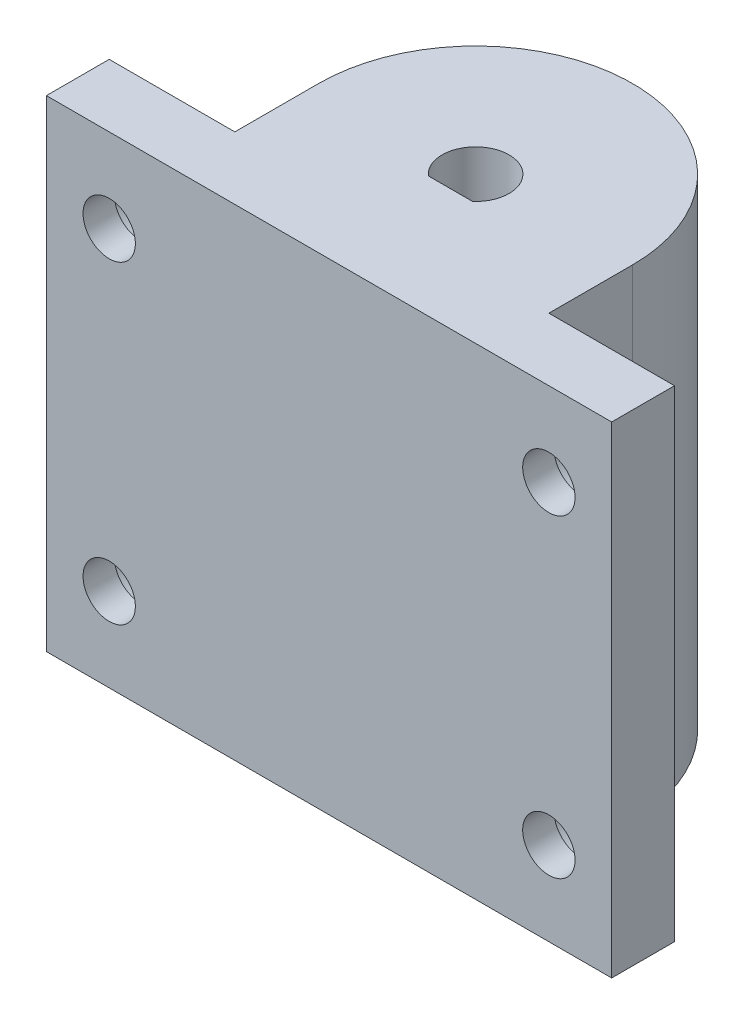
ISO-10303-21;
HEADER;
FILE_DESCRIPTION(('STEP AP214'),'2;1');
FILE_NAME('part.step','',(''),(''),'','','');
FILE_SCHEMA(('AUTOMOTIVE_DESIGN { 1 0 10303 214 1 1 1 1 }'));
ENDSEC;
DATA;
#1=APPLICATION_CONTEXT('core data for automotive mechanical design processes');
#2=APPLICATION_PROTOCOL_DEFINITION('international standard','automotive_design',2000,#1);
#3=PRODUCT_CONTEXT('',#1,'mechanical');
#4=PRODUCT('Part','Part','',(#3));
#5=PRODUCT_RELATED_PRODUCT_CATEGORY('part','',(#4));
#6=PRODUCT_DEFINITION_FORMATION('','',#4);
#7=PRODUCT_DEFINITION_CONTEXT('part definition',#1,'design');
#8=PRODUCT_DEFINITION('design','',#6,#7);
#9=PRODUCT_DEFINITION_SHAPE('','',#8);
#10=(LENGTH_UNIT() NAMED_UNIT(*) SI_UNIT(.MILLI.,.METRE.));
#11=(NAMED_UNIT(*) PLANE_ANGLE_UNIT() SI_UNIT($,.RADIAN.));
#12=(NAMED_UNIT(*) SI_UNIT($,.STERADIAN.) SOLID_ANGLE_UNIT());
#13=UNCERTAINTY_MEASURE_WITH_UNIT(LENGTH_MEASURE(1.E-05),#10,'distance_accuracy_value','');
#14=(GEOMETRIC_REPRESENTATION_CONTEXT(3) GLOBAL_UNCERTAINTY_ASSIGNED_CONTEXT((#13)) GLOBAL_UNIT_ASSIGNED_CONTEXT((#10,
#11,#12)) REPRESENTATION_CONTEXT('',''));
#15=CARTESIAN_POINT('',(0.,0.,0.));
#16=DIRECTION('',(0.,0.,1.));
#17=DIRECTION('',(1.,0.,0.));
#18=AXIS2_PLACEMENT_3D('',#15,#16,#17);
#19=CARTESIAN_POINT('',(114.5,19.,14.));
#20=DIRECTION('',(0.,0.,1.));
#21=DIRECTION('',(1.,0.,0.));
#22=AXIS2_PLACEMENT_3D('',#19,#20,#21);
#23=CYLINDRICAL_SURFACE('',#22,1.25);
#24=CARTESIAN_POINT('',(114.5,19.,17.));
#25=DIRECTION('',(0.,0.,1.));
#26=DIRECTION('',(1.,0.,0.));
#27=AXIS2_PLACEMENT_3D('',#24,#25,#26);
#28=CIRCLE('',#27,1.25);
#29=CARTESIAN_POINT('',(115.75,19.,17.));
#30=VERTEX_POINT('',#29);
#31=EDGE_CURVE('E299',#30,#30,#28,.T.);
#32=ORIENTED_EDGE('',*,*,#31,.T.);
#33=EDGE_LOOP('',(#32));
#34=FACE_BOUND('',#33,.T.);
#35=CARTESIAN_POINT('',(114.5,19.,15.5));
#36=DIRECTION('',(0.,0.,-1.));
#37=DIRECTION('',(-1.,0.,0.));
#38=AXIS2_PLACEMENT_3D('',#35,#36,#37);
#39=CIRCLE('',#38,1.25);
#40=CARTESIAN_POINT('',(113.25,19.,15.5));
#41=VERTEX_POINT('',#40);
#42=EDGE_CURVE('E129',#41,#41,#39,.F.);
#43=ORIENTED_EDGE('',*,*,#42,.F.);
#44=EDGE_LOOP('',(#43));
#45=FACE_BOUND('',#44,.T.);
#46=ADVANCED_FACE('F125',(#34,#45),#23,.F.);
#47=CARTESIAN_POINT('',(114.5,4.,14.));
#48=DIRECTION('',(0.,0.,1.));
#49=DIRECTION('',(1.,0.,0.));
#50=AXIS2_PLACEMENT_3D('',#47,#48,#49);
#51=CYLINDRICAL_SURFACE('',#50,1.25);
#52=CARTESIAN_POINT('',(114.5,4.,17.));
#53=DIRECTION('',(0.,0.,1.));
#54=DIRECTION('',(1.,0.,0.));
#55=AXIS2_PLACEMENT_3D('',#52,#53,#54);
#56=CIRCLE('',#55,1.25);
#57=CARTESIAN_POINT('',(115.75,4.,17.));
#58=VERTEX_POINT('',#57);
#59=EDGE_CURVE('E291',#58,#58,#56,.T.);
#60=ORIENTED_EDGE('',*,*,#59,.T.);
#61=EDGE_LOOP('',(#60));
#62=FACE_BOUND('',#61,.T.);
#63=CARTESIAN_POINT('',(114.5,4.,15.5));
#64=DIRECTION('',(0.,0.,-1.));
#65=DIRECTION('',(-1.,0.,0.));
#66=AXIS2_PLACEMENT_3D('',#63,#64,#65);
#67=CIRCLE('',#66,1.25);
#68=CARTESIAN_POINT('',(113.25,4.,15.5));
#69=VERTEX_POINT('',#68);
#70=EDGE_CURVE('E277',#69,#69,#67,.F.);
#71=ORIENTED_EDGE('',*,*,#70,.F.);
#72=EDGE_LOOP('',(#71));
#73=FACE_BOUND('',#72,.T.);
#74=ADVANCED_FACE('F350',(#62,#73),#51,.F.);
#75=CARTESIAN_POINT('',(135.5,4.,14.));
#76=DIRECTION('',(0.,0.,1.));
#77=DIRECTION('',(1.,0.,0.));
#78=AXIS2_PLACEMENT_3D('',#75,#76,#77);
#79=CYLINDRICAL_SURFACE('',#78,1.25000000000001);
#80=CARTESIAN_POINT('',(135.5,4.,17.));
#81=DIRECTION('',(0.,0.,1.));
#82=DIRECTION('',(1.,0.,0.));
#83=AXIS2_PLACEMENT_3D('',#80,#81,#82);
#84=CIRCLE('',#83,1.25000000000001);
#85=CARTESIAN_POINT('',(136.75,4.,17.));
#86=VERTEX_POINT('',#85);
#87=EDGE_CURVE('E286',#86,#86,#84,.T.);
#88=ORIENTED_EDGE('',*,*,#87,.T.);
#89=EDGE_LOOP('',(#88));
#90=FACE_BOUND('',#89,.T.);
#91=CARTESIAN_POINT('',(135.5,4.,15.5));
#92=DIRECTION('',(0.,0.,-1.));
#93=DIRECTION('',(-1.,0.,0.));
#94=AXIS2_PLACEMENT_3D('',#91,#92,#93);
#95=CIRCLE('',#94,1.25000000000001);
#96=CARTESIAN_POINT('',(134.25,4.,15.5));
#97=VERTEX_POINT('',#96);
#98=EDGE_CURVE('E274',#97,#97,#95,.F.);
#99=ORIENTED_EDGE('',*,*,#98,.F.);
#100=EDGE_LOOP('',(#99));
#101=FACE_BOUND('',#100,.T.);
#102=ADVANCED_FACE('F357',(#90,#101),#79,.F.);
#103=CARTESIAN_POINT('',(135.5,19.,14.));
#104=DIRECTION('',(0.,0.,1.));
#105=DIRECTION('',(1.,0.,0.));
#106=AXIS2_PLACEMENT_3D('',#103,#104,#105);
#107=CYLINDRICAL_SURFACE('',#106,1.25000000000001);
#108=CARTESIAN_POINT('',(135.5,19.,17.));
#109=DIRECTION('',(0.,0.,1.));
#110=DIRECTION('',(1.,0.,0.));
#111=AXIS2_PLACEMENT_3D('',#108,#109,#110);
#112=CIRCLE('',#111,1.25000000000001);
#113=CARTESIAN_POINT('',(136.75,19.,17.));
#114=VERTEX_POINT('',#113);
#115=EDGE_CURVE('E282',#114,#114,#112,.T.);
#116=ORIENTED_EDGE('',*,*,#115,.T.);
#117=EDGE_LOOP('',(#116));
#118=FACE_BOUND('',#117,.T.);
#119=CARTESIAN_POINT('',(135.5,19.,15.5));
#120=DIRECTION('',(0.,0.,-1.));
#121=DIRECTION('',(-1.,0.,0.));
#122=AXIS2_PLACEMENT_3D('',#119,#120,#121);
#123=CIRCLE('',#122,1.25000000000001);
#124=CARTESIAN_POINT('',(134.25,19.,15.5));
#125=VERTEX_POINT('',#124);
#126=EDGE_CURVE('E271',#125,#125,#123,.F.);
#127=ORIENTED_EDGE('',*,*,#126,.F.);
#128=EDGE_LOOP('',(#127));
#129=FACE_BOUND('',#128,.T.);
#130=ADVANCED_FACE('F380',(#118,#129),#107,.F.);
#131=CARTESIAN_POINT('',(0.,23.,0.));
#132=DIRECTION('',(0.,1.,0.));
#133=DIRECTION('',(0.,0.,1.));
#134=AXIS2_PLACEMENT_3D('',#131,#132,#133);
#135=PLANE('',#134);
#136=DIRECTION('',(0.,0.,1.));
#137=VECTOR('',#136,1.);
#138=CARTESIAN_POINT('',(117.5,23.,0.));
#139=LINE('',#138,#137);
#140=CARTESIAN_POINT('',(117.5,23.,10.));
#141=VERTEX_POINT('',#140);
#142=CARTESIAN_POINT('',(117.5,23.,14.));
#143=VERTEX_POINT('',#142);
#144=EDGE_CURVE('E238',#141,#143,#139,.T.);
#145=ORIENTED_EDGE('',*,*,#144,.T.);
#146=DIRECTION('',(1.,0.,0.));
#147=VECTOR('',#146,1.);
#148=CARTESIAN_POINT('',(111.5,23.,14.));
#149=LINE('',#148,#147);
#150=CARTESIAN_POINT('',(111.5,23.,14.));
#151=VERTEX_POINT('',#150);
#152=EDGE_CURVE('E213',#151,#143,#149,.T.);
#153=ORIENTED_EDGE('',*,*,#152,.F.);
#154=DIRECTION('',(0.,0.,1.));
#155=VECTOR('',#154,1.);
#156=CARTESIAN_POINT('',(111.5,23.,14.));
#157=LINE('',#156,#155);
#158=CARTESIAN_POINT('',(111.5,23.,17.));
#159=VERTEX_POINT('',#158);
#160=EDGE_CURVE('E310',#151,#159,#157,.T.);
#161=ORIENTED_EDGE('',*,*,#160,.T.);
#162=DIRECTION('',(1.,0.,0.));
#163=VECTOR('',#162,1.);
#164=CARTESIAN_POINT('',(102.5,23.,17.));
#165=LINE('',#164,#163);
#166=CARTESIAN_POINT('',(138.5,23.,17.));
#167=VERTEX_POINT('',#166);
#168=EDGE_CURVE('E228',#159,#167,#165,.T.);
#169=ORIENTED_EDGE('',*,*,#168,.T.);
#170=DIRECTION('',(0.,0.,1.));
#171=VECTOR('',#170,1.);
#172=CARTESIAN_POINT('',(138.5,23.,14.));
#173=LINE('',#172,#171);
#174=CARTESIAN_POINT('',(138.5,23.,14.));
#175=VERTEX_POINT('',#174);
#176=EDGE_CURVE('E220',#175,#167,#173,.T.);
#177=ORIENTED_EDGE('',*,*,#176,.F.);
#178=CARTESIAN_POINT('',(132.5,23.,14.));
#179=VERTEX_POINT('',#178);
#180=EDGE_CURVE('E202',#179,#175,#149,.T.);
#181=ORIENTED_EDGE('',*,*,#180,.F.);
#182=DIRECTION('',(0.,0.,1.));
#183=VECTOR('',#182,1.);
#184=CARTESIAN_POINT('',(132.5,23.,0.));
#185=LINE('',#184,#183);
#186=CARTESIAN_POINT('',(132.5,23.,10.));
#187=VERTEX_POINT('',#186);
#188=EDGE_CURVE('E242',#187,#179,#185,.T.);
#189=ORIENTED_EDGE('',*,*,#188,.F.);
#190=CARTESIAN_POINT('',(125.,23.,10.));
#191=DIRECTION('',(0.,1.,0.));
#192=DIRECTION('',(0.,0.,1.));
#193=AXIS2_PLACEMENT_3D('',#190,#191,#192);
#194=CIRCLE('',#193,7.50000000000001);
#195=EDGE_CURVE('E249',#187,#141,#194,.T.);
#196=ORIENTED_EDGE('',*,*,#195,.T.);
#197=EDGE_LOOP('',(#145,#153,#161,#169,#177,#181,#189,#196));
#198=FACE_BOUND('',#197,.T.);
#199=DIRECTION('',(1.,0.,0.));
#200=VECTOR('',#199,1.);
#201=CARTESIAN_POINT('',(0.,23.,11.2));
#202=LINE('',#201,#200);
#203=CARTESIAN_POINT('',(123.941699475574,23.,11.2));
#204=VERTEX_POINT('',#203);
#205=CARTESIAN_POINT('',(126.058300524426,23.,11.2));
#206=VERTEX_POINT('',#205);
#207=EDGE_CURVE('E255',#204,#206,#202,.T.);
#208=ORIENTED_EDGE('',*,*,#207,.F.);
#209=CARTESIAN_POINT('',(125.,23.,10.));
#210=DIRECTION('',(0.,1.,0.));
#211=DIRECTION('',(0.,0.,1.));
#212=AXIS2_PLACEMENT_3D('',#209,#210,#211);
#213=CIRCLE('',#212,1.59999999999999);
#214=EDGE_CURVE('E261',#206,#204,#213,.T.);
#215=ORIENTED_EDGE('',*,*,#214,.F.);
#216=EDGE_LOOP('',(#208,#215));
#217=FACE_BOUND('',#216,.T.);
#218=ADVANCED_FACE('F225',(#198,#217),#135,.T.);
#219=CARTESIAN_POINT('',(0.,0.,0.));
#220=DIRECTION('',(0.,1.,0.));
#221=DIRECTION('',(0.,0.,1.));
#222=AXIS2_PLACEMENT_3D('',#219,#220,#221);
#223=PLANE('',#222);
#224=CARTESIAN_POINT('',(125.,0.,10.));
#225=DIRECTION('',(0.,1.,0.));
#226=DIRECTION('',(0.,0.,1.));
#227=AXIS2_PLACEMENT_3D('',#224,#225,#226);
#228=CIRCLE('',#227,1.59999999999999);
#229=CARTESIAN_POINT('',(126.058300524426,0.,11.2));
#230=VERTEX_POINT('',#229);
#231=CARTESIAN_POINT('',(123.941699475574,0.,11.2));
#232=VERTEX_POINT('',#231);
#233=EDGE_CURVE('E260',#230,#232,#228,.T.);
#234=ORIENTED_EDGE('',*,*,#233,.T.);
#235=DIRECTION('',(1.,0.,0.));
#236=VECTOR('',#235,1.);
#237=CARTESIAN_POINT('',(0.,0.,11.2));
#238=LINE('',#237,#236);
#239=EDGE_CURVE('E257',#232,#230,#238,.T.);
#240=ORIENTED_EDGE('',*,*,#239,.T.);
#241=EDGE_LOOP('',(#234,#240));
#242=FACE_BOUND('',#241,.T.);
#243=DIRECTION('',(0.,0.,1.));
#244=VECTOR('',#243,1.);
#245=CARTESIAN_POINT('',(132.5,0.,0.));
#246=LINE('',#245,#244);
#247=CARTESIAN_POINT('',(132.5,0.,10.));
#248=VERTEX_POINT('',#247);
#249=CARTESIAN_POINT('',(132.5,0.,14.));
#250=VERTEX_POINT('',#249);
#251=EDGE_CURVE('E244',#248,#250,#246,.T.);
#252=ORIENTED_EDGE('',*,*,#251,.T.);
#253=DIRECTION('',(1.,0.,0.));
#254=VECTOR('',#253,1.);
#255=CARTESIAN_POINT('',(111.5,0.,14.));
#256=LINE('',#255,#254);
#257=CARTESIAN_POINT('',(138.5,0.,14.));
#258=VERTEX_POINT('',#257);
#259=EDGE_CURVE('E223',#250,#258,#256,.T.);
#260=ORIENTED_EDGE('',*,*,#259,.T.);
#261=DIRECTION('',(0.,0.,1.));
#262=VECTOR('',#261,1.);
#263=CARTESIAN_POINT('',(138.5,0.,14.));
#264=LINE('',#263,#262);
#265=CARTESIAN_POINT('',(138.5,0.,17.));
#266=VERTEX_POINT('',#265);
#267=EDGE_CURVE('E222',#258,#266,#264,.T.);
#268=ORIENTED_EDGE('',*,*,#267,.T.);
#269=DIRECTION('',(1.,0.,0.));
#270=VECTOR('',#269,1.);
#271=CARTESIAN_POINT('',(102.5,0.,17.));
#272=LINE('',#271,#270);
#273=CARTESIAN_POINT('',(111.5,0.,17.));
#274=VERTEX_POINT('',#273);
#275=EDGE_CURVE('E236',#274,#266,#272,.T.);
#276=ORIENTED_EDGE('',*,*,#275,.F.);
#277=DIRECTION('',(0.,0.,1.));
#278=VECTOR('',#277,1.);
#279=CARTESIAN_POINT('',(111.5,0.,14.));
#280=LINE('',#279,#278);
#281=CARTESIAN_POINT('',(111.5,0.,14.));
#282=VERTEX_POINT('',#281);
#283=EDGE_CURVE('E232',#282,#274,#280,.T.);
#284=ORIENTED_EDGE('',*,*,#283,.F.);
#285=CARTESIAN_POINT('',(117.5,0.,14.));
#286=VERTEX_POINT('',#285);
#287=EDGE_CURVE('E304',#282,#286,#256,.T.);
#288=ORIENTED_EDGE('',*,*,#287,.T.);
#289=DIRECTION('',(0.,0.,1.));
#290=VECTOR('',#289,1.);
#291=CARTESIAN_POINT('',(117.5,0.,0.));
#292=LINE('',#291,#290);
#293=CARTESIAN_POINT('',(117.5,0.,10.));
#294=VERTEX_POINT('',#293);
#295=EDGE_CURVE('E142',#294,#286,#292,.T.);
#296=ORIENTED_EDGE('',*,*,#295,.F.);
#297=CARTESIAN_POINT('',(125.,0.,10.));
#298=DIRECTION('',(0.,1.,0.));
#299=DIRECTION('',(0.,0.,1.));
#300=AXIS2_PLACEMENT_3D('',#297,#298,#299);
#301=CIRCLE('',#300,7.50000000000001);
#302=EDGE_CURVE('E241',#248,#294,#301,.T.);
#303=ORIENTED_EDGE('',*,*,#302,.F.);
#304=EDGE_LOOP('',(#252,#260,#268,#276,#284,#288,#296,#303));
#305=FACE_BOUND('',#304,.T.);
#306=ADVANCED_FACE('F127',(#242,#305),#223,.F.);
#307=CARTESIAN_POINT('',(0.,0.,11.2));
#308=DIRECTION('',(0.,0.,1.));
#309=DIRECTION('',(1.,0.,0.));
#310=AXIS2_PLACEMENT_3D('',#307,#308,#309);
#311=PLANE('',#310);
#312=ORIENTED_EDGE('',*,*,#207,.T.);
#313=DIRECTION('',(0.,1.,0.));
#314=VECTOR('',#313,1.);
#315=CARTESIAN_POINT('',(126.058300524426,0.,11.2));
#316=LINE('',#315,#314);
#317=EDGE_CURVE('E264',#230,#206,#316,.T.);
#318=ORIENTED_EDGE('',*,*,#317,.F.);
#319=ORIENTED_EDGE('',*,*,#239,.F.);
#320=DIRECTION('',(0.,1.,0.));
#321=VECTOR('',#320,1.);
#322=CARTESIAN_POINT('',(123.941699475574,0.,11.2));
#323=LINE('',#322,#321);
#324=EDGE_CURVE('E134',#232,#204,#323,.T.);
#325=ORIENTED_EDGE('',*,*,#324,.T.);
#326=EDGE_LOOP('',(#312,#318,#319,#325));
#327=FACE_BOUND('',#326,.T.);
#328=ADVANCED_FACE('F345',(#327),#311,.F.);
#329=CARTESIAN_POINT('',(125.,0.,10.));
#330=DIRECTION('',(0.,1.,0.));
#331=DIRECTION('',(0.,0.,1.));
#332=AXIS2_PLACEMENT_3D('',#329,#330,#331);
#333=CYLINDRICAL_SURFACE('',#332,1.59999999999999);
#334=ORIENTED_EDGE('',*,*,#214,.T.);
#335=ORIENTED_EDGE('',*,*,#324,.F.);
#336=ORIENTED_EDGE('',*,*,#233,.F.);
#337=ORIENTED_EDGE('',*,*,#317,.T.);
#338=EDGE_LOOP('',(#334,#335,#336,#337));
#339=FACE_BOUND('',#338,.T.);
#340=ADVANCED_FACE('F336',(#339),#333,.F.);
#341=CARTESIAN_POINT('',(132.5,0.,0.));
#342=DIRECTION('',(-1.,0.,0.));
#343=DIRECTION('',(0.,0.,1.));
#344=AXIS2_PLACEMENT_3D('',#341,#342,#343);
#345=PLANE('',#344);
#346=ORIENTED_EDGE('',*,*,#188,.T.);
#347=DIRECTION('',(0.,-1.,0.));
#348=VECTOR('',#347,1.);
#349=CARTESIAN_POINT('',(132.5,0.,14.));
#350=LINE('',#349,#348);
#351=EDGE_CURVE('E208',#179,#250,#350,.T.);
#352=ORIENTED_EDGE('',*,*,#351,.T.);
#353=ORIENTED_EDGE('',*,*,#251,.F.);
#354=DIRECTION('',(0.,1.,0.));
#355=VECTOR('',#354,1.);
#356=CARTESIAN_POINT('',(132.5,0.,10.));
#357=LINE('',#356,#355);
#358=EDGE_CURVE('E253',#248,#187,#357,.T.);
#359=ORIENTED_EDGE('',*,*,#358,.T.);
#360=EDGE_LOOP('',(#346,#352,#353,#359));
#361=FACE_BOUND('',#360,.T.);
#362=ADVANCED_FACE('F334',(#361),#345,.F.);
#363=CARTESIAN_POINT('',(125.,0.,10.));
#364=DIRECTION('',(0.,1.,0.));
#365=DIRECTION('',(0.,0.,1.));
#366=AXIS2_PLACEMENT_3D('',#363,#364,#365);
#367=CYLINDRICAL_SURFACE('',#366,7.50000000000001);
#368=ORIENTED_EDGE('',*,*,#195,.F.);
#369=ORIENTED_EDGE('',*,*,#358,.F.);
#370=ORIENTED_EDGE('',*,*,#302,.T.);
#371=DIRECTION('',(0.,1.,0.));
#372=VECTOR('',#371,1.);
#373=CARTESIAN_POINT('',(117.5,0.,10.));
#374=LINE('',#373,#372);
#375=EDGE_CURVE('E247',#294,#141,#374,.T.);
#376=ORIENTED_EDGE('',*,*,#375,.T.);
#377=EDGE_LOOP('',(#368,#369,#370,#376));
#378=FACE_BOUND('',#377,.T.);
#379=ADVANCED_FACE('F331',(#378),#367,.T.);
#380=CARTESIAN_POINT('',(117.5,0.,0.));
#381=DIRECTION('',(-1.,0.,0.));
#382=DIRECTION('',(0.,0.,1.));
#383=AXIS2_PLACEMENT_3D('',#380,#381,#382);
#384=PLANE('',#383);
#385=DIRECTION('',(0.,-1.,0.));
#386=VECTOR('',#385,1.);
#387=CARTESIAN_POINT('',(117.5,0.,14.));
#388=LINE('',#387,#386);
#389=EDGE_CURVE('E12',#143,#286,#388,.T.);
#390=ORIENTED_EDGE('',*,*,#389,.F.);
#391=ORIENTED_EDGE('',*,*,#144,.F.);
#392=ORIENTED_EDGE('',*,*,#375,.F.);
#393=ORIENTED_EDGE('',*,*,#295,.T.);
#394=EDGE_LOOP('',(#390,#391,#392,#393));
#395=FACE_BOUND('',#394,.T.);
#396=ADVANCED_FACE('F332',(#395),#384,.T.);
#397=CARTESIAN_POINT('',(102.5,0.,17.));
#398=DIRECTION('',(0.,0.,1.));
#399=DIRECTION('',(1.,0.,0.));
#400=AXIS2_PLACEMENT_3D('',#397,#398,#399);
#401=PLANE('',#400);
#402=ORIENTED_EDGE('',*,*,#275,.T.);
#403=DIRECTION('',(0.,-1.,0.));
#404=VECTOR('',#403,1.);
#405=CARTESIAN_POINT('',(138.5,23.,17.));
#406=LINE('',#405,#404);
#407=EDGE_CURVE('E301',#167,#266,#406,.T.);
#408=ORIENTED_EDGE('',*,*,#407,.F.);
#409=ORIENTED_EDGE('',*,*,#168,.F.);
#410=DIRECTION('',(0.,-1.,0.));
#411=VECTOR('',#410,1.);
#412=CARTESIAN_POINT('',(111.5,23.,17.));
#413=LINE('',#412,#411);
#414=EDGE_CURVE('E214',#159,#274,#413,.T.);
#415=ORIENTED_EDGE('',*,*,#414,.T.);
#416=EDGE_LOOP('',(#402,#408,#409,#415));
#417=FACE_BOUND('',#416,.T.);
#418=ORIENTED_EDGE('',*,*,#59,.F.);
#419=EDGE_LOOP('',(#418));
#420=FACE_BOUND('',#419,.T.);
#421=ORIENTED_EDGE('',*,*,#31,.F.);
#422=EDGE_LOOP('',(#421));
#423=FACE_BOUND('',#422,.T.);
#424=ORIENTED_EDGE('',*,*,#87,.F.);
#425=EDGE_LOOP('',(#424));
#426=FACE_BOUND('',#425,.T.);
#427=ORIENTED_EDGE('',*,*,#115,.F.);
#428=EDGE_LOOP('',(#427));
#429=FACE_BOUND('',#428,.T.);
#430=ADVANCED_FACE('F322',(#417,#420,#423,#426,#429),#401,.T.);
#431=CARTESIAN_POINT('',(111.5,23.,14.));
#432=DIRECTION('',(-1.,0.,0.));
#433=DIRECTION('',(0.,0.,1.));
#434=AXIS2_PLACEMENT_3D('',#431,#432,#433);
#435=PLANE('',#434);
#436=ORIENTED_EDGE('',*,*,#414,.F.);
#437=ORIENTED_EDGE('',*,*,#160,.F.);
#438=DIRECTION('',(0.,-1.,0.));
#439=VECTOR('',#438,1.);
#440=CARTESIAN_POINT('',(111.5,23.,14.));
#441=LINE('',#440,#439);
#442=EDGE_CURVE('E307',#151,#282,#441,.T.);
#443=ORIENTED_EDGE('',*,*,#442,.T.);
#444=ORIENTED_EDGE('',*,*,#283,.T.);
#445=EDGE_LOOP('',(#436,#437,#443,#444));
#446=FACE_BOUND('',#445,.T.);
#447=ADVANCED_FACE('F317',(#446),#435,.T.);
#448=CARTESIAN_POINT('',(0.,0.,14.));
#449=DIRECTION('',(0.,0.,-1.));
#450=DIRECTION('',(-1.,0.,0.));
#451=AXIS2_PLACEMENT_3D('',#448,#449,#450);
#452=PLANE('',#451);
#453=CARTESIAN_POINT('',(114.5,19.,14.));
#454=DIRECTION('',(0.,0.,-1.));
#455=DIRECTION('',(-1.,0.,0.));
#456=AXIS2_PLACEMENT_3D('',#453,#454,#455);
#457=CIRCLE('',#456,2.);
#458=CARTESIAN_POINT('',(112.5,19.,14.));
#459=VERTEX_POINT('',#458);
#460=EDGE_CURVE('E430',#459,#459,#457,.T.);
#461=ORIENTED_EDGE('',*,*,#460,.F.);
#462=EDGE_LOOP('',(#461));
#463=FACE_BOUND('',#462,.T.);
#464=CARTESIAN_POINT('',(114.5,4.,14.));
#465=DIRECTION('',(0.,0.,-1.));
#466=DIRECTION('',(-1.,0.,0.));
#467=AXIS2_PLACEMENT_3D('',#464,#465,#466);
#468=CIRCLE('',#467,2.);
#469=CARTESIAN_POINT('',(112.5,4.,14.));
#470=VERTEX_POINT('',#469);
#471=EDGE_CURVE('E294',#470,#470,#468,.T.);
#472=ORIENTED_EDGE('',*,*,#471,.F.);
#473=EDGE_LOOP('',(#472));
#474=FACE_BOUND('',#473,.T.);
#475=ORIENTED_EDGE('',*,*,#152,.T.);
#476=ORIENTED_EDGE('',*,*,#389,.T.);
#477=ORIENTED_EDGE('',*,*,#287,.F.);
#478=ORIENTED_EDGE('',*,*,#442,.F.);
#479=EDGE_LOOP('',(#475,#476,#477,#478));
#480=FACE_BOUND('',#479,.T.);
#481=ADVANCED_FACE('F326',(#463,#474,#480),#452,.T.);
#482=CARTESIAN_POINT('',(135.5,4.,14.));
#483=DIRECTION('',(0.,0.,-1.));
#484=DIRECTION('',(-1.,0.,0.));
#485=AXIS2_PLACEMENT_3D('',#482,#483,#484);
#486=CIRCLE('',#485,2.);
#487=CARTESIAN_POINT('',(133.5,4.,14.));
#488=VERTEX_POINT('',#487);
#489=EDGE_CURVE('E441',#488,#488,#486,.T.);
#490=ORIENTED_EDGE('',*,*,#489,.F.);
#491=EDGE_LOOP('',(#490));
#492=FACE_BOUND('',#491,.T.);
#493=CARTESIAN_POINT('',(135.5,19.,14.));
#494=DIRECTION('',(0.,0.,-1.));
#495=DIRECTION('',(-1.,0.,0.));
#496=AXIS2_PLACEMENT_3D('',#493,#494,#495);
#497=CIRCLE('',#496,2.);
#498=CARTESIAN_POINT('',(133.5,19.,14.));
#499=VERTEX_POINT('',#498);
#500=EDGE_CURVE('E433',#499,#499,#497,.T.);
#501=ORIENTED_EDGE('',*,*,#500,.F.);
#502=EDGE_LOOP('',(#501));
#503=FACE_BOUND('',#502,.T.);
#504=ORIENTED_EDGE('',*,*,#351,.F.);
#505=ORIENTED_EDGE('',*,*,#180,.T.);
#506=DIRECTION('',(0.,-1.,0.));
#507=VECTOR('',#506,1.);
#508=CARTESIAN_POINT('',(138.5,23.,14.));
#509=LINE('',#508,#507);
#510=EDGE_CURVE('E205',#175,#258,#509,.T.);
#511=ORIENTED_EDGE('',*,*,#510,.T.);
#512=ORIENTED_EDGE('',*,*,#259,.F.);
#513=EDGE_LOOP('',(#504,#505,#511,#512));
#514=FACE_BOUND('',#513,.T.);
#515=ADVANCED_FACE('F204',(#492,#503,#514),#452,.T.);
#516=CARTESIAN_POINT('',(138.5,23.,14.));
#517=DIRECTION('',(-1.,0.,0.));
#518=DIRECTION('',(0.,0.,1.));
#519=AXIS2_PLACEMENT_3D('',#516,#517,#518);
#520=PLANE('',#519);
#521=ORIENTED_EDGE('',*,*,#407,.T.);
#522=ORIENTED_EDGE('',*,*,#267,.F.);
#523=ORIENTED_EDGE('',*,*,#510,.F.);
#524=ORIENTED_EDGE('',*,*,#176,.T.);
#525=EDGE_LOOP('',(#521,#522,#523,#524));
#526=FACE_BOUND('',#525,.T.);
#527=ADVANCED_FACE('F219',(#526),#520,.F.);
#528=CARTESIAN_POINT('',(135.5,19.,15.5));
#529=DIRECTION('',(0.,0.,-1.));
#530=DIRECTION('',(-1.,0.,0.));
#531=AXIS2_PLACEMENT_3D('',#528,#529,#530);
#532=PLANE('',#531);
#533=CARTESIAN_POINT('',(135.5,19.,15.5));
#534=DIRECTION('',(0.,0.,-1.));
#535=DIRECTION('',(-1.,0.,0.));
#536=AXIS2_PLACEMENT_3D('',#533,#534,#535);
#537=CIRCLE('',#536,2.);
#538=CARTESIAN_POINT('',(133.5,19.,15.5));
#539=VERTEX_POINT('',#538);
#540=EDGE_CURVE('E438',#539,#539,#537,.T.);
#541=ORIENTED_EDGE('',*,*,#540,.T.);
#542=EDGE_LOOP('',(#541));
#543=FACE_BOUND('',#542,.T.);
#544=ORIENTED_EDGE('',*,*,#126,.T.);
#545=EDGE_LOOP('',(#544));
#546=FACE_BOUND('',#545,.T.);
#547=ADVANCED_FACE('F369',(#543,#546),#532,.T.);
#548=CARTESIAN_POINT('',(135.5,19.,15.5));
#549=DIRECTION('',(0.,0.,-1.));
#550=DIRECTION('',(-1.,0.,0.));
#551=AXIS2_PLACEMENT_3D('',#548,#549,#550);
#552=CYLINDRICAL_SURFACE('',#551,2.);
#553=ORIENTED_EDGE('',*,*,#540,.F.);
#554=EDGE_LOOP('',(#553));
#555=FACE_BOUND('',#554,.T.);
#556=ORIENTED_EDGE('',*,*,#500,.T.);
#557=EDGE_LOOP('',(#556));
#558=FACE_BOUND('',#557,.T.);
#559=ADVANCED_FACE('F405',(#555,#558),#552,.F.);
#560=CARTESIAN_POINT('',(135.5,4.,15.5));
#561=DIRECTION('',(0.,0.,-1.));
#562=DIRECTION('',(-1.,0.,0.));
#563=AXIS2_PLACEMENT_3D('',#560,#561,#562);
#564=PLANE('',#563);
#565=CARTESIAN_POINT('',(135.5,4.,15.5));
#566=DIRECTION('',(0.,0.,-1.));
#567=DIRECTION('',(-1.,0.,0.));
#568=AXIS2_PLACEMENT_3D('',#565,#566,#567);
#569=CIRCLE('',#568,2.);
#570=CARTESIAN_POINT('',(133.5,4.,15.5));
#571=VERTEX_POINT('',#570);
#572=EDGE_CURVE('E444',#571,#571,#569,.T.);
#573=ORIENTED_EDGE('',*,*,#572,.T.);
#574=EDGE_LOOP('',(#573));
#575=FACE_BOUND('',#574,.T.);
#576=ORIENTED_EDGE('',*,*,#98,.T.);
#577=EDGE_LOOP('',(#576));
#578=FACE_BOUND('',#577,.T.);
#579=ADVANCED_FACE('F402',(#575,#578),#564,.T.);
#580=CARTESIAN_POINT('',(135.5,4.,15.5));
#581=DIRECTION('',(0.,0.,-1.));
#582=DIRECTION('',(-1.,0.,0.));
#583=AXIS2_PLACEMENT_3D('',#580,#581,#582);
#584=CYLINDRICAL_SURFACE('',#583,2.);
#585=ORIENTED_EDGE('',*,*,#572,.F.);
#586=EDGE_LOOP('',(#585));
#587=FACE_BOUND('',#586,.T.);
#588=ORIENTED_EDGE('',*,*,#489,.T.);
#589=EDGE_LOOP('',(#588));
#590=FACE_BOUND('',#589,.T.);
#591=ADVANCED_FACE('F400',(#587,#590),#584,.F.);
#592=CARTESIAN_POINT('',(114.5,4.,15.5));
#593=DIRECTION('',(0.,0.,-1.));
#594=DIRECTION('',(-1.,0.,0.));
#595=AXIS2_PLACEMENT_3D('',#592,#593,#594);
#596=PLANE('',#595);
#597=CARTESIAN_POINT('',(114.5,4.,15.5));
#598=DIRECTION('',(0.,0.,-1.));
#599=DIRECTION('',(-1.,0.,0.));
#600=AXIS2_PLACEMENT_3D('',#597,#598,#599);
#601=CIRCLE('',#600,2.);
#602=CARTESIAN_POINT('',(112.5,4.,15.5));
#603=VERTEX_POINT('',#602);
#604=EDGE_CURVE('E275',#603,#603,#601,.T.);
#605=ORIENTED_EDGE('',*,*,#604,.T.);
#606=EDGE_LOOP('',(#605));
#607=FACE_BOUND('',#606,.T.);
#608=ORIENTED_EDGE('',*,*,#70,.T.);
#609=EDGE_LOOP('',(#608));
#610=FACE_BOUND('',#609,.T.);
#611=ADVANCED_FACE('F396',(#607,#610),#596,.T.);
#612=CARTESIAN_POINT('',(114.5,4.,15.5));
#613=DIRECTION('',(0.,0.,-1.));
#614=DIRECTION('',(-1.,0.,0.));
#615=AXIS2_PLACEMENT_3D('',#612,#613,#614);
#616=CYLINDRICAL_SURFACE('',#615,2.);
#617=ORIENTED_EDGE('',*,*,#604,.F.);
#618=EDGE_LOOP('',(#617));
#619=FACE_BOUND('',#618,.T.);
#620=ORIENTED_EDGE('',*,*,#471,.T.);
#621=EDGE_LOOP('',(#620));
#622=FACE_BOUND('',#621,.T.);
#623=ADVANCED_FACE('F392',(#619,#622),#616,.F.);
#624=CARTESIAN_POINT('',(114.5,19.,15.5));
#625=DIRECTION('',(0.,0.,-1.));
#626=DIRECTION('',(-1.,0.,0.));
#627=AXIS2_PLACEMENT_3D('',#624,#625,#626);
#628=PLANE('',#627);
#629=CARTESIAN_POINT('',(114.5,19.,15.5));
#630=DIRECTION('',(0.,0.,-1.));
#631=DIRECTION('',(-1.,0.,0.));
#632=AXIS2_PLACEMENT_3D('',#629,#630,#631);
#633=CIRCLE('',#632,2.);
#634=CARTESIAN_POINT('',(112.5,19.,15.5));
#635=VERTEX_POINT('',#634);
#636=EDGE_CURVE('E427',#635,#635,#633,.T.);
#637=ORIENTED_EDGE('',*,*,#636,.T.);
#638=EDGE_LOOP('',(#637));
#639=FACE_BOUND('',#638,.T.);
#640=ORIENTED_EDGE('',*,*,#42,.T.);
#641=EDGE_LOOP('',(#640));
#642=FACE_BOUND('',#641,.T.);
#643=ADVANCED_FACE('F395',(#639,#642),#628,.T.);
#644=CARTESIAN_POINT('',(114.5,19.,15.5));
#645=DIRECTION('',(0.,0.,-1.));
#646=DIRECTION('',(-1.,0.,0.));
#647=AXIS2_PLACEMENT_3D('',#644,#645,#646);
#648=CYLINDRICAL_SURFACE('',#647,2.);
#649=ORIENTED_EDGE('',*,*,#636,.F.);
#650=EDGE_LOOP('',(#649));
#651=FACE_BOUND('',#650,.T.);
#652=ORIENTED_EDGE('',*,*,#460,.T.);
#653=EDGE_LOOP('',(#652));
#654=FACE_BOUND('',#653,.T.);
#655=ADVANCED_FACE('F418',(#651,#654),#648,.F.);
#656=CLOSED_SHELL('',(#46,#74,#102,#130,#218,#306,#328,#340,#362,#379,#396,#430,#447,#481,#515,
#527,#547,#559,#579,#591,#611,#623,#643,#655));
#657=MANIFOLD_SOLID_BREP('B2',#656);
#658=ADVANCED_BREP_SHAPE_REPRESENTATION('',(#18,#657),#14);
#659=SHAPE_DEFINITION_REPRESENTATION(#9,#658);
ENDSEC;
END-ISO-10303-21;
